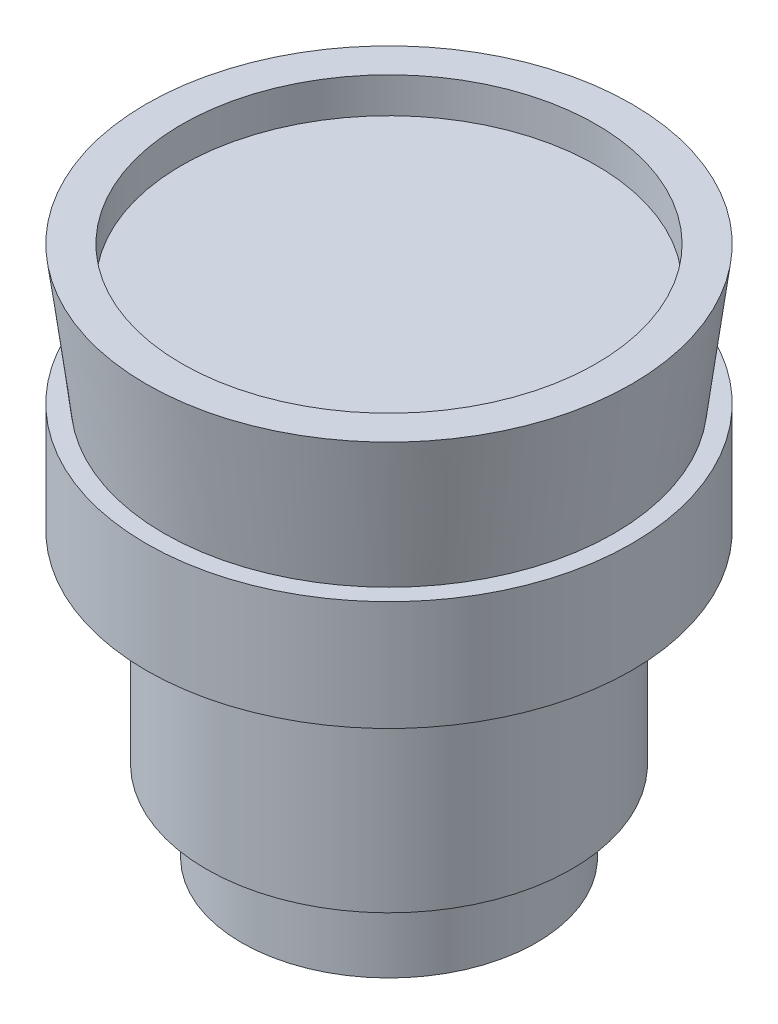
ISO-10303-21;
HEADER;
FILE_DESCRIPTION(('STEP AP214'),'2;1');
FILE_NAME('part.step','',(''),(''),'','','');
FILE_SCHEMA(('AUTOMOTIVE_DESIGN { 1 0 10303 214 1 1 1 1 }'));
ENDSEC;
DATA;
#1=APPLICATION_CONTEXT('core data for automotive mechanical design processes');
#2=APPLICATION_PROTOCOL_DEFINITION('international standard','automotive_design',2000,#1);
#3=PRODUCT_CONTEXT('',#1,'mechanical');
#4=PRODUCT('Part','Part','',(#3));
#5=PRODUCT_RELATED_PRODUCT_CATEGORY('part','',(#4));
#6=PRODUCT_DEFINITION_FORMATION('','',#4);
#7=PRODUCT_DEFINITION_CONTEXT('part definition',#1,'design');
#8=PRODUCT_DEFINITION('design','',#6,#7);
#9=PRODUCT_DEFINITION_SHAPE('','',#8);
#10=(LENGTH_UNIT() NAMED_UNIT(*) SI_UNIT(.MILLI.,.METRE.));
#11=(NAMED_UNIT(*) PLANE_ANGLE_UNIT() SI_UNIT($,.RADIAN.));
#12=(NAMED_UNIT(*) SI_UNIT($,.STERADIAN.) SOLID_ANGLE_UNIT());
#13=UNCERTAINTY_MEASURE_WITH_UNIT(LENGTH_MEASURE(1.E-05),#10,'distance_accuracy_value','');
#14=(GEOMETRIC_REPRESENTATION_CONTEXT(3) GLOBAL_UNCERTAINTY_ASSIGNED_CONTEXT((#13)) GLOBAL_UNIT_ASSIGNED_CONTEXT((#10,
#11,#12)) REPRESENTATION_CONTEXT('',''));
#15=CARTESIAN_POINT('',(0.,0.,0.));
#16=DIRECTION('',(0.,0.,1.));
#17=DIRECTION('',(1.,0.,0.));
#18=AXIS2_PLACEMENT_3D('',#15,#16,#17);
#19=CARTESIAN_POINT('',(0.,17.78,0.));
#20=DIRECTION('',(0.,1.,0.));
#21=DIRECTION('',(0.,0.,1.));
#22=AXIS2_PLACEMENT_3D('',#19,#20,#21);
#23=PLANE('',#22);
#24=CARTESIAN_POINT('',(0.,17.78,0.));
#25=DIRECTION('',(0.,1.,0.));
#26=DIRECTION('',(0.,0.,1.));
#27=AXIS2_PLACEMENT_3D('',#24,#25,#26);
#28=CIRCLE('',#27,14.859);
#29=CARTESIAN_POINT('',(0.,17.78,14.859));
#30=VERTEX_POINT('',#29);
#31=EDGE_CURVE('E83',#30,#30,#28,.T.);
#32=ORIENTED_EDGE('',*,*,#31,.F.);
#33=EDGE_LOOP('',(#32));
#34=FACE_BOUND('',#33,.T.);
#35=CARTESIAN_POINT('',(0.,17.78,0.));
#36=DIRECTION('',(0.,1.,0.));
#37=DIRECTION('',(0.,0.,1.));
#38=AXIS2_PLACEMENT_3D('',#35,#36,#37);
#39=CIRCLE('',#38,17.399);
#40=CARTESIAN_POINT('',(0.,17.78,17.399));
#41=VERTEX_POINT('',#40);
#42=EDGE_CURVE('E10',#41,#41,#39,.T.);
#43=ORIENTED_EDGE('',*,*,#42,.T.);
#44=EDGE_LOOP('',(#43));
#45=FACE_BOUND('',#44,.T.);
#46=ADVANCED_FACE('F41',(#34,#45),#23,.T.);
#47=CARTESIAN_POINT('',(0.,17.78,0.));
#48=DIRECTION('',(0.,1.,0.));
#49=DIRECTION('',(0.,0.,1.));
#50=AXIS2_PLACEMENT_3D('',#47,#48,#49);
#51=CONICAL_SURFACE('',#50,17.399,0.127509558215238);
#52=CARTESIAN_POINT('',(0.,7.874,0.));
#53=DIRECTION('',(0.,1.,0.));
#54=DIRECTION('',(0.,0.,1.));
#55=AXIS2_PLACEMENT_3D('',#52,#53,#54);
#56=CIRCLE('',#55,16.129);
#57=CARTESIAN_POINT('',(0.,7.874,16.129));
#58=VERTEX_POINT('',#57);
#59=EDGE_CURVE('E48',#58,#58,#56,.T.);
#60=ORIENTED_EDGE('',*,*,#59,.T.);
#61=EDGE_LOOP('',(#60));
#62=FACE_BOUND('',#61,.T.);
#63=ORIENTED_EDGE('',*,*,#42,.F.);
#64=EDGE_LOOP('',(#63));
#65=FACE_BOUND('',#64,.T.);
#66=ADVANCED_FACE('F99',(#62,#65),#51,.T.);
#67=CARTESIAN_POINT('',(0.,7.874,16.129));
#68=DIRECTION('',(0.,1.,0.));
#69=DIRECTION('',(0.,0.,1.));
#70=AXIS2_PLACEMENT_3D('',#67,#68,#69);
#71=PLANE('',#70);
#72=CARTESIAN_POINT('',(0.,7.874,0.));
#73=DIRECTION('',(0.,1.,0.));
#74=DIRECTION('',(0.,0.,1.));
#75=AXIS2_PLACEMENT_3D('',#72,#73,#74);
#76=CIRCLE('',#75,17.399);
#77=CARTESIAN_POINT('',(0.,7.874,17.399));
#78=VERTEX_POINT('',#77);
#79=EDGE_CURVE('E55',#78,#78,#76,.T.);
#80=ORIENTED_EDGE('',*,*,#79,.T.);
#81=EDGE_LOOP('',(#80));
#82=FACE_BOUND('',#81,.T.);
#83=ORIENTED_EDGE('',*,*,#59,.F.);
#84=EDGE_LOOP('',(#83));
#85=FACE_BOUND('',#84,.T.);
#86=ADVANCED_FACE('F103',(#82,#85),#71,.T.);
#87=CARTESIAN_POINT('',(0.,17.78,0.));
#88=DIRECTION('',(0.,1.,0.));
#89=DIRECTION('',(0.,0.,1.));
#90=AXIS2_PLACEMENT_3D('',#87,#88,#89);
#91=CYLINDRICAL_SURFACE('',#90,17.399);
#92=CARTESIAN_POINT('',(0.,0.,0.));
#93=DIRECTION('',(0.,1.,0.));
#94=DIRECTION('',(0.,0.,1.));
#95=AXIS2_PLACEMENT_3D('',#92,#93,#94);
#96=CIRCLE('',#95,17.399);
#97=CARTESIAN_POINT('',(0.,0.,17.399));
#98=VERTEX_POINT('',#97);
#99=EDGE_CURVE('E60',#98,#98,#96,.T.);
#100=ORIENTED_EDGE('',*,*,#99,.T.);
#101=EDGE_LOOP('',(#100));
#102=FACE_BOUND('',#101,.T.);
#103=ORIENTED_EDGE('',*,*,#79,.F.);
#104=EDGE_LOOP('',(#103));
#105=FACE_BOUND('',#104,.T.);
#106=ADVANCED_FACE('F107',(#102,#105),#91,.T.);
#107=CARTESIAN_POINT('',(0.,0.,17.399));
#108=DIRECTION('',(0.,-1.,0.));
#109=DIRECTION('',(0.,0.,-1.));
#110=AXIS2_PLACEMENT_3D('',#107,#108,#109);
#111=PLANE('',#110);
#112=CARTESIAN_POINT('',(0.,0.,0.));
#113=DIRECTION('',(0.,1.,0.));
#114=DIRECTION('',(0.,0.,1.));
#115=AXIS2_PLACEMENT_3D('',#112,#113,#114);
#116=CIRCLE('',#115,13.1064);
#117=CARTESIAN_POINT('',(0.,0.,13.1064));
#118=VERTEX_POINT('',#117);
#119=EDGE_CURVE('E66',#118,#118,#116,.T.);
#120=ORIENTED_EDGE('',*,*,#119,.T.);
#121=EDGE_LOOP('',(#120));
#122=FACE_BOUND('',#121,.T.);
#123=ORIENTED_EDGE('',*,*,#99,.F.);
#124=EDGE_LOOP('',(#123));
#125=FACE_BOUND('',#124,.T.);
#126=ADVANCED_FACE('F114',(#122,#125),#111,.T.);
#127=CARTESIAN_POINT('',(0.,17.78,0.));
#128=DIRECTION('',(0.,1.,0.));
#129=DIRECTION('',(0.,0.,1.));
#130=AXIS2_PLACEMENT_3D('',#127,#128,#129);
#131=CYLINDRICAL_SURFACE('',#130,13.1064);
#132=CARTESIAN_POINT('',(0.,-14.478,0.));
#133=DIRECTION('',(0.,1.,0.));
#134=DIRECTION('',(0.,0.,1.));
#135=AXIS2_PLACEMENT_3D('',#132,#133,#134);
#136=CIRCLE('',#135,13.1064);
#137=CARTESIAN_POINT('',(0.,-14.478,13.1064));
#138=VERTEX_POINT('',#137);
#139=EDGE_CURVE('E70',#138,#138,#136,.T.);
#140=ORIENTED_EDGE('',*,*,#139,.T.);
#141=EDGE_LOOP('',(#140));
#142=FACE_BOUND('',#141,.T.);
#143=ORIENTED_EDGE('',*,*,#119,.F.);
#144=EDGE_LOOP('',(#143));
#145=FACE_BOUND('',#144,.T.);
#146=ADVANCED_FACE('F118',(#142,#145),#131,.T.);
#147=CARTESIAN_POINT('',(0.,-14.478,13.1064));
#148=DIRECTION('',(0.,-1.,0.));
#149=DIRECTION('',(0.,0.,-1.));
#150=AXIS2_PLACEMENT_3D('',#147,#148,#149);
#151=PLANE('',#150);
#152=CARTESIAN_POINT('',(0.,-14.478,0.));
#153=DIRECTION('',(0.,1.,0.));
#154=DIRECTION('',(0.,0.,1.));
#155=AXIS2_PLACEMENT_3D('',#152,#153,#154);
#156=CIRCLE('',#155,10.5664);
#157=CARTESIAN_POINT('',(0.,-14.478,10.5664));
#158=VERTEX_POINT('',#157);
#159=EDGE_CURVE('E74',#158,#158,#156,.T.);
#160=ORIENTED_EDGE('',*,*,#159,.T.);
#161=EDGE_LOOP('',(#160));
#162=FACE_BOUND('',#161,.T.);
#163=ORIENTED_EDGE('',*,*,#139,.F.);
#164=EDGE_LOOP('',(#163));
#165=FACE_BOUND('',#164,.T.);
#166=ADVANCED_FACE('F122',(#162,#165),#151,.T.);
#167=CARTESIAN_POINT('',(0.,17.78,0.));
#168=DIRECTION('',(0.,1.,0.));
#169=DIRECTION('',(0.,0.,1.));
#170=AXIS2_PLACEMENT_3D('',#167,#168,#169);
#171=CYLINDRICAL_SURFACE('',#170,10.5664);
#172=CARTESIAN_POINT('',(0.,-20.32,0.));
#173=DIRECTION('',(0.,1.,0.));
#174=DIRECTION('',(0.,0.,1.));
#175=AXIS2_PLACEMENT_3D('',#172,#173,#174);
#176=CIRCLE('',#175,10.5664);
#177=CARTESIAN_POINT('',(0.,-20.32,10.5664));
#178=VERTEX_POINT('',#177);
#179=EDGE_CURVE('E78',#178,#178,#176,.T.);
#180=ORIENTED_EDGE('',*,*,#179,.T.);
#181=EDGE_LOOP('',(#180));
#182=FACE_BOUND('',#181,.T.);
#183=ORIENTED_EDGE('',*,*,#159,.F.);
#184=EDGE_LOOP('',(#183));
#185=FACE_BOUND('',#184,.T.);
#186=ADVANCED_FACE('F126',(#182,#185),#171,.T.);
#187=CARTESIAN_POINT('',(0.,-20.32,10.5664));
#188=DIRECTION('',(0.,-1.,0.));
#189=DIRECTION('',(0.,0.,-1.));
#190=AXIS2_PLACEMENT_3D('',#187,#188,#189);
#191=PLANE('',#190);
#192=ORIENTED_EDGE('',*,*,#179,.F.);
#193=EDGE_LOOP('',(#192));
#194=FACE_BOUND('',#193,.T.);
#195=ADVANCED_FACE('F94',(#194),#191,.T.);
#196=CARTESIAN_POINT('',(0.,15.24,0.));
#197=DIRECTION('',(0.,1.,0.));
#198=DIRECTION('',(0.,0.,1.));
#199=AXIS2_PLACEMENT_3D('',#196,#197,#198);
#200=CYLINDRICAL_SURFACE('',#199,14.859);
#201=CARTESIAN_POINT('',(0.,15.24,0.));
#202=DIRECTION('',(0.,1.,0.));
#203=DIRECTION('',(0.,0.,1.));
#204=AXIS2_PLACEMENT_3D('',#201,#202,#203);
#205=CIRCLE('',#204,14.859);
#206=CARTESIAN_POINT('',(0.,15.24,14.859));
#207=VERTEX_POINT('',#206);
#208=EDGE_CURVE('E82',#207,#207,#205,.T.);
#209=ORIENTED_EDGE('',*,*,#208,.F.);
#210=EDGE_LOOP('',(#209));
#211=FACE_BOUND('',#210,.T.);
#212=ORIENTED_EDGE('',*,*,#31,.T.);
#213=EDGE_LOOP('',(#212));
#214=FACE_BOUND('',#213,.T.);
#215=ADVANCED_FACE('F91',(#211,#214),#200,.F.);
#216=CARTESIAN_POINT('',(0.,15.24,0.));
#217=DIRECTION('',(0.,1.,0.));
#218=DIRECTION('',(0.,0.,1.));
#219=AXIS2_PLACEMENT_3D('',#216,#217,#218);
#220=PLANE('',#219);
#221=ORIENTED_EDGE('',*,*,#208,.T.);
#222=EDGE_LOOP('',(#221));
#223=FACE_BOUND('',#222,.T.);
#224=ADVANCED_FACE('F89',(#223),#220,.T.);
#225=CLOSED_SHELL('',(#46,#66,#86,#106,#126,#146,#166,#186,#195,#215,#224));
#226=MANIFOLD_SOLID_BREP('B2',#225);
#227=ADVANCED_BREP_SHAPE_REPRESENTATION('',(#18,#226),#14);
#228=SHAPE_DEFINITION_REPRESENTATION(#9,#227);
ENDSEC;
END-ISO-10303-21;
